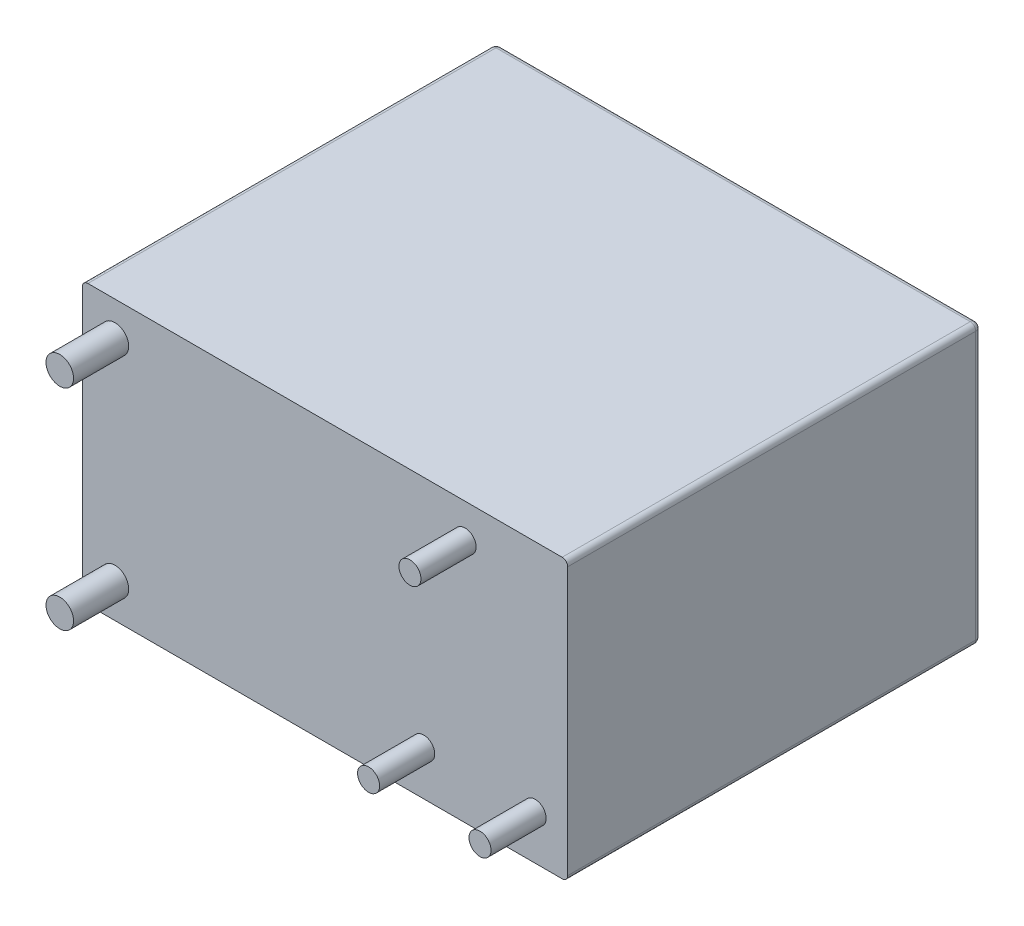
ISO-10303-21;
HEADER;
FILE_DESCRIPTION(('STEP AP214'),'2;1');
FILE_NAME('part.step','',(''),(''),'','','');
FILE_SCHEMA(('AUTOMOTIVE_DESIGN { 1 0 10303 214 1 1 1 1 }'));
ENDSEC;
DATA;
#1=APPLICATION_CONTEXT('core data for automotive mechanical design processes');
#2=APPLICATION_PROTOCOL_DEFINITION('international standard','automotive_design',2000,#1);
#3=PRODUCT_CONTEXT('',#1,'mechanical');
#4=PRODUCT('Part','Part','',(#3));
#5=PRODUCT_RELATED_PRODUCT_CATEGORY('part','',(#4));
#6=PRODUCT_DEFINITION_FORMATION('','',#4);
#7=PRODUCT_DEFINITION_CONTEXT('part definition',#1,'design');
#8=PRODUCT_DEFINITION('design','',#6,#7);
#9=PRODUCT_DEFINITION_SHAPE('','',#8);
#10=(LENGTH_UNIT() NAMED_UNIT(*) SI_UNIT(.MILLI.,.METRE.));
#11=(NAMED_UNIT(*) PLANE_ANGLE_UNIT() SI_UNIT($,.RADIAN.));
#12=(NAMED_UNIT(*) SI_UNIT($,.STERADIAN.) SOLID_ANGLE_UNIT());
#13=UNCERTAINTY_MEASURE_WITH_UNIT(LENGTH_MEASURE(1.E-05),#10,'distance_accuracy_value','');
#14=(GEOMETRIC_REPRESENTATION_CONTEXT(3) GLOBAL_UNCERTAINTY_ASSIGNED_CONTEXT((#13)) GLOBAL_UNIT_ASSIGNED_CONTEXT((#10,
#11,#12)) REPRESENTATION_CONTEXT('',''));
#15=CARTESIAN_POINT('',(0.,0.,0.));
#16=DIRECTION('',(0.,0.,1.));
#17=DIRECTION('',(1.,0.,0.));
#18=AXIS2_PLACEMENT_3D('',#15,#16,#17);
#19=CARTESIAN_POINT('',(0.,0.,-15.));
#20=DIRECTION('',(-1.,0.,0.));
#21=DIRECTION('',(0.,0.,1.));
#22=AXIS2_PLACEMENT_3D('',#19,#20,#21);
#23=PLANE('',#22);
#24=DIRECTION('',(0.,-1.,0.));
#25=VECTOR('',#24,1.);
#26=CARTESIAN_POINT('',(0.,0.,-14.8));
#27=LINE('',#26,#25);
#28=CARTESIAN_POINT('',(0.,9.9,-14.8));
#29=VERTEX_POINT('',#28);
#30=CARTESIAN_POINT('',(0.,0.2,-14.8));
#31=VERTEX_POINT('',#30);
#32=EDGE_CURVE('E156',#29,#31,#27,.T.);
#33=ORIENTED_EDGE('',*,*,#32,.T.);
#34=DIRECTION('',(0.,0.,1.));
#35=VECTOR('',#34,1.);
#36=CARTESIAN_POINT('',(0.,0.2,-15.));
#37=LINE('',#36,#35);
#38=CARTESIAN_POINT('',(0.,0.2,0.));
#39=VERTEX_POINT('',#38);
#40=EDGE_CURVE('E158',#31,#39,#37,.T.);
#41=ORIENTED_EDGE('',*,*,#40,.T.);
#42=DIRECTION('',(0.,-1.,0.));
#43=VECTOR('',#42,1.);
#44=CARTESIAN_POINT('',(0.,0.,0.));
#45=LINE('',#44,#43);
#46=CARTESIAN_POINT('',(0.,9.9,0.));
#47=VERTEX_POINT('',#46);
#48=EDGE_CURVE('E117',#47,#39,#45,.T.);
#49=ORIENTED_EDGE('',*,*,#48,.F.);
#50=DIRECTION('',(0.,0.,1.));
#51=VECTOR('',#50,1.);
#52=CARTESIAN_POINT('',(0.,9.9,-15.));
#53=LINE('',#52,#51);
#54=EDGE_CURVE('E154',#47,#29,#53,.F.);
#55=ORIENTED_EDGE('',*,*,#54,.T.);
#56=EDGE_LOOP('',(#33,#41,#49,#55));
#57=FACE_BOUND('',#56,.T.);
#58=ADVANCED_FACE('F35',(#57),#23,.T.);
#59=CARTESIAN_POINT('',(0.,10.1,-15.));
#60=DIRECTION('',(0.,1.,0.));
#61=DIRECTION('',(0.,0.,1.));
#62=AXIS2_PLACEMENT_3D('',#59,#60,#61);
#63=PLANE('',#62);
#64=DIRECTION('',(-1.,0.,0.));
#65=VECTOR('',#64,1.);
#66=CARTESIAN_POINT('',(0.,10.1,-14.8));
#67=LINE('',#66,#65);
#68=CARTESIAN_POINT('',(17.4,10.1,-14.8));
#69=VERTEX_POINT('',#68);
#70=CARTESIAN_POINT('',(0.2,10.1,-14.8));
#71=VERTEX_POINT('',#70);
#72=EDGE_CURVE('E51',#69,#71,#67,.T.);
#73=ORIENTED_EDGE('',*,*,#72,.T.);
#74=DIRECTION('',(0.,0.,1.));
#75=VECTOR('',#74,1.);
#76=CARTESIAN_POINT('',(0.2,10.1,-15.));
#77=LINE('',#76,#75);
#78=CARTESIAN_POINT('',(0.2,10.1,0.));
#79=VERTEX_POINT('',#78);
#80=EDGE_CURVE('E11',#71,#79,#77,.T.);
#81=ORIENTED_EDGE('',*,*,#80,.T.);
#82=DIRECTION('',(-1.,0.,0.));
#83=VECTOR('',#82,1.);
#84=CARTESIAN_POINT('',(0.,10.1,0.));
#85=LINE('',#84,#83);
#86=CARTESIAN_POINT('',(17.4,10.1,0.));
#87=VERTEX_POINT('',#86);
#88=EDGE_CURVE('E231',#87,#79,#85,.T.);
#89=ORIENTED_EDGE('',*,*,#88,.F.);
#90=DIRECTION('',(0.,0.,1.));
#91=VECTOR('',#90,1.);
#92=CARTESIAN_POINT('',(17.4,10.1,-15.));
#93=LINE('',#92,#91);
#94=EDGE_CURVE('E44',#87,#69,#93,.F.);
#95=ORIENTED_EDGE('',*,*,#94,.T.);
#96=EDGE_LOOP('',(#73,#81,#89,#95));
#97=FACE_BOUND('',#96,.T.);
#98=ADVANCED_FACE('F276',(#97),#63,.T.);
#99=CARTESIAN_POINT('',(17.6,0.,-15.));
#100=DIRECTION('',(1.,0.,0.));
#101=DIRECTION('',(0.,0.,-1.));
#102=AXIS2_PLACEMENT_3D('',#99,#100,#101);
#103=PLANE('',#102);
#104=DIRECTION('',(0.,1.,0.));
#105=VECTOR('',#104,1.);
#106=CARTESIAN_POINT('',(17.6,0.,0.));
#107=LINE('',#106,#105);
#108=CARTESIAN_POINT('',(17.6,0.2,0.));
#109=VERTEX_POINT('',#108);
#110=CARTESIAN_POINT('',(17.6,9.9,0.));
#111=VERTEX_POINT('',#110);
#112=EDGE_CURVE('E131',#109,#111,#107,.T.);
#113=ORIENTED_EDGE('',*,*,#112,.F.);
#114=DIRECTION('',(0.,0.,1.));
#115=VECTOR('',#114,1.);
#116=CARTESIAN_POINT('',(17.6,0.2,-15.));
#117=LINE('',#116,#115);
#118=CARTESIAN_POINT('',(17.6,0.2,-14.8));
#119=VERTEX_POINT('',#118);
#120=EDGE_CURVE('E152',#109,#119,#117,.F.);
#121=ORIENTED_EDGE('',*,*,#120,.T.);
#122=DIRECTION('',(0.,1.,0.));
#123=VECTOR('',#122,1.);
#124=CARTESIAN_POINT('',(17.6,0.,-14.8));
#125=LINE('',#124,#123);
#126=CARTESIAN_POINT('',(17.6,9.9,-14.8));
#127=VERTEX_POINT('',#126);
#128=EDGE_CURVE('E150',#119,#127,#125,.T.);
#129=ORIENTED_EDGE('',*,*,#128,.T.);
#130=DIRECTION('',(0.,0.,1.));
#131=VECTOR('',#130,1.);
#132=CARTESIAN_POINT('',(17.6,9.9,-15.));
#133=LINE('',#132,#131);
#134=EDGE_CURVE('E148',#127,#111,#133,.T.);
#135=ORIENTED_EDGE('',*,*,#134,.T.);
#136=EDGE_LOOP('',(#113,#121,#129,#135));
#137=FACE_BOUND('',#136,.T.);
#138=ADVANCED_FACE('F282',(#137),#103,.T.);
#139=CARTESIAN_POINT('',(0.,0.,-15.));
#140=DIRECTION('',(0.,-1.,0.));
#141=DIRECTION('',(0.,0.,-1.));
#142=AXIS2_PLACEMENT_3D('',#139,#140,#141);
#143=PLANE('',#142);
#144=DIRECTION('',(1.,0.,0.));
#145=VECTOR('',#144,1.);
#146=CARTESIAN_POINT('',(0.,0.,-14.8));
#147=LINE('',#146,#145);
#148=CARTESIAN_POINT('',(0.2,0.,-14.8));
#149=VERTEX_POINT('',#148);
#150=CARTESIAN_POINT('',(17.4,0.,-14.8));
#151=VERTEX_POINT('',#150);
#152=EDGE_CURVE('E137',#149,#151,#147,.T.);
#153=ORIENTED_EDGE('',*,*,#152,.T.);
#154=DIRECTION('',(0.,0.,1.));
#155=VECTOR('',#154,1.);
#156=CARTESIAN_POINT('',(17.4,0.,-15.));
#157=LINE('',#156,#155);
#158=CARTESIAN_POINT('',(17.4,0.,0.));
#159=VERTEX_POINT('',#158);
#160=EDGE_CURVE('E130',#151,#159,#157,.T.);
#161=ORIENTED_EDGE('',*,*,#160,.T.);
#162=DIRECTION('',(1.,0.,0.));
#163=VECTOR('',#162,1.);
#164=CARTESIAN_POINT('',(0.,0.,0.));
#165=LINE('',#164,#163);
#166=CARTESIAN_POINT('',(0.2,0.,0.));
#167=VERTEX_POINT('',#166);
#168=EDGE_CURVE('E115',#167,#159,#165,.T.);
#169=ORIENTED_EDGE('',*,*,#168,.F.);
#170=DIRECTION('',(0.,0.,1.));
#171=VECTOR('',#170,1.);
#172=CARTESIAN_POINT('',(0.2,0.,-15.));
#173=LINE('',#172,#171);
#174=EDGE_CURVE('E127',#167,#149,#173,.F.);
#175=ORIENTED_EDGE('',*,*,#174,.T.);
#176=EDGE_LOOP('',(#153,#161,#169,#175));
#177=FACE_BOUND('',#176,.T.);
#178=ADVANCED_FACE('F126',(#177),#143,.T.);
#179=CARTESIAN_POINT('',(0.,0.,-15.));
#180=DIRECTION('',(0.,0.,-1.));
#181=DIRECTION('',(-1.,0.,0.));
#182=AXIS2_PLACEMENT_3D('',#179,#180,#181);
#183=PLANE('',#182);
#184=CARTESIAN_POINT('',(1.93925831557391,1.32698570753947,-15.));
#185=DIRECTION('',(0.,0.,-1.));
#186=DIRECTION('',(-1.,0.,0.));
#187=AXIS2_PLACEMENT_3D('',#184,#185,#186);
#188=CIRCLE('',#187,0.5);
#189=CARTESIAN_POINT('',(1.43925831557391,1.32698570753947,-15.));
#190=VERTEX_POINT('',#189);
#191=EDGE_CURVE('E217',#190,#190,#188,.T.);
#192=ORIENTED_EDGE('',*,*,#191,.F.);
#193=EDGE_LOOP('',(#192));
#194=FACE_BOUND('',#193,.T.);
#195=DIRECTION('',(0.,1.,0.));
#196=VECTOR('',#195,1.);
#197=CARTESIAN_POINT('',(17.4,0.,-15.));
#198=LINE('',#197,#196);
#199=CARTESIAN_POINT('',(17.4,9.9,-15.));
#200=VERTEX_POINT('',#199);
#201=CARTESIAN_POINT('',(17.4,0.2,-15.));
#202=VERTEX_POINT('',#201);
#203=EDGE_CURVE('E164',#200,#202,#198,.F.);
#204=ORIENTED_EDGE('',*,*,#203,.T.);
#205=DIRECTION('',(1.,0.,0.));
#206=VECTOR('',#205,1.);
#207=CARTESIAN_POINT('',(0.,0.2,-15.));
#208=LINE('',#207,#206);
#209=CARTESIAN_POINT('',(0.2,0.2,-15.));
#210=VERTEX_POINT('',#209);
#211=EDGE_CURVE('E166',#202,#210,#208,.F.);
#212=ORIENTED_EDGE('',*,*,#211,.T.);
#213=DIRECTION('',(0.,-1.,0.));
#214=VECTOR('',#213,1.);
#215=CARTESIAN_POINT('',(0.2,0.,-15.));
#216=LINE('',#215,#214);
#217=CARTESIAN_POINT('',(0.2,9.9,-15.));
#218=VERTEX_POINT('',#217);
#219=EDGE_CURVE('E162',#210,#218,#216,.F.);
#220=ORIENTED_EDGE('',*,*,#219,.T.);
#221=DIRECTION('',(-1.,0.,0.));
#222=VECTOR('',#221,1.);
#223=CARTESIAN_POINT('',(0.,9.9,-15.));
#224=LINE('',#223,#222);
#225=EDGE_CURVE('E160',#218,#200,#224,.F.);
#226=ORIENTED_EDGE('',*,*,#225,.T.);
#227=EDGE_LOOP('',(#204,#212,#220,#226));
#228=FACE_BOUND('',#227,.T.);
#229=ADVANCED_FACE('F253',(#194,#228),#183,.T.);
#230=CARTESIAN_POINT('',(0.,0.,0.));
#231=DIRECTION('',(0.,0.,-1.));
#232=DIRECTION('',(-1.,0.,0.));
#233=AXIS2_PLACEMENT_3D('',#230,#231,#232);
#234=PLANE('',#233);
#235=CARTESIAN_POINT('',(1.18,1.24,0.));
#236=DIRECTION('',(0.,0.,-1.));
#237=DIRECTION('',(-1.,0.,0.));
#238=AXIS2_PLACEMENT_3D('',#235,#236,#237);
#239=CIRCLE('',#238,0.5);
#240=CARTESIAN_POINT('',(0.68,1.24,0.));
#241=VERTEX_POINT('',#240);
#242=EDGE_CURVE('E141',#241,#241,#239,.F.);
#243=ORIENTED_EDGE('',*,*,#242,.F.);
#244=EDGE_LOOP('',(#243));
#245=FACE_BOUND('',#244,.T.);
#246=CARTESIAN_POINT('',(16.42,1.6069825328216,0.));
#247=DIRECTION('',(0.,0.,-1.));
#248=DIRECTION('',(-1.,0.,0.));
#249=AXIS2_PLACEMENT_3D('',#246,#247,#248);
#250=CIRCLE('',#249,0.400000000000001);
#251=CARTESIAN_POINT('',(16.02,1.6069825328216,0.));
#252=VERTEX_POINT('',#251);
#253=EDGE_CURVE('E243',#252,#252,#250,.F.);
#254=ORIENTED_EDGE('',*,*,#253,.F.);
#255=EDGE_LOOP('',(#254));
#256=FACE_BOUND('',#255,.T.);
#257=CARTESIAN_POINT('',(12.38,1.60698253282159,0.));
#258=DIRECTION('',(0.,0.,-1.));
#259=DIRECTION('',(-1.,0.,0.));
#260=AXIS2_PLACEMENT_3D('',#257,#258,#259);
#261=CIRCLE('',#260,0.399999999999999);
#262=CARTESIAN_POINT('',(11.98,1.60698253282159,0.));
#263=VERTEX_POINT('',#262);
#264=EDGE_CURVE('E240',#263,#263,#261,.F.);
#265=ORIENTED_EDGE('',*,*,#264,.F.);
#266=EDGE_LOOP('',(#265));
#267=FACE_BOUND('',#266,.T.);
#268=CARTESIAN_POINT('',(13.88,8.86,0.));
#269=DIRECTION('',(0.,0.,-1.));
#270=DIRECTION('',(-1.,0.,0.));
#271=AXIS2_PLACEMENT_3D('',#268,#269,#270);
#272=CIRCLE('',#271,0.399999999999999);
#273=CARTESIAN_POINT('',(13.48,8.86,0.));
#274=VERTEX_POINT('',#273);
#275=EDGE_CURVE('E237',#274,#274,#272,.F.);
#276=ORIENTED_EDGE('',*,*,#275,.F.);
#277=EDGE_LOOP('',(#276));
#278=FACE_BOUND('',#277,.T.);
#279=CARTESIAN_POINT('',(1.18,8.86,0.));
#280=DIRECTION('',(0.,0.,-1.));
#281=DIRECTION('',(-1.,0.,0.));
#282=AXIS2_PLACEMENT_3D('',#279,#280,#281);
#283=CIRCLE('',#282,0.500000000000001);
#284=CARTESIAN_POINT('',(0.679999999999999,8.86,0.));
#285=VERTEX_POINT('',#284);
#286=EDGE_CURVE('E234',#285,#285,#283,.F.);
#287=ORIENTED_EDGE('',*,*,#286,.F.);
#288=EDGE_LOOP('',(#287));
#289=FACE_BOUND('',#288,.T.);
#290=ORIENTED_EDGE('',*,*,#168,.T.);
#291=CARTESIAN_POINT('',(17.4,0.2,0.));
#292=DIRECTION('',(0.,0.,-1.));
#293=DIRECTION('',(-1.,0.,0.));
#294=AXIS2_PLACEMENT_3D('',#291,#292,#293);
#295=CIRCLE('',#294,0.2);
#296=EDGE_CURVE('E121',#159,#109,#295,.F.);
#297=ORIENTED_EDGE('',*,*,#296,.T.);
#298=ORIENTED_EDGE('',*,*,#112,.T.);
#299=CARTESIAN_POINT('',(17.4,9.9,0.));
#300=DIRECTION('',(0.,0.,-1.));
#301=DIRECTION('',(-1.,0.,0.));
#302=AXIS2_PLACEMENT_3D('',#299,#300,#301);
#303=CIRCLE('',#302,0.2);
#304=EDGE_CURVE('E139',#111,#87,#303,.F.);
#305=ORIENTED_EDGE('',*,*,#304,.T.);
#306=ORIENTED_EDGE('',*,*,#88,.T.);
#307=CARTESIAN_POINT('',(0.2,9.9,0.));
#308=DIRECTION('',(0.,0.,-1.));
#309=DIRECTION('',(-1.,0.,0.));
#310=AXIS2_PLACEMENT_3D('',#307,#308,#309);
#311=CIRCLE('',#310,0.2);
#312=EDGE_CURVE('E122',#79,#47,#311,.F.);
#313=ORIENTED_EDGE('',*,*,#312,.T.);
#314=ORIENTED_EDGE('',*,*,#48,.T.);
#315=CARTESIAN_POINT('',(0.2,0.2,0.));
#316=DIRECTION('',(0.,0.,-1.));
#317=DIRECTION('',(-1.,0.,0.));
#318=AXIS2_PLACEMENT_3D('',#315,#316,#317);
#319=CIRCLE('',#318,0.2);
#320=EDGE_CURVE('E112',#39,#167,#319,.F.);
#321=ORIENTED_EDGE('',*,*,#320,.T.);
#322=EDGE_LOOP('',(#290,#297,#298,#305,#306,#313,#314,#321));
#323=FACE_BOUND('',#322,.T.);
#324=ADVANCED_FACE('F114',(#245,#256,#267,#278,#289,#323),#234,.F.);
#325=CARTESIAN_POINT('',(1.18,8.86,2.));
#326=DIRECTION('',(0.,0.,-1.));
#327=DIRECTION('',(-1.,0.,0.));
#328=AXIS2_PLACEMENT_3D('',#325,#326,#327);
#329=CYLINDRICAL_SURFACE('',#328,0.500000000000001);
#330=CARTESIAN_POINT('',(1.18,8.86,2.));
#331=DIRECTION('',(0.,0.,1.));
#332=DIRECTION('',(1.,0.,0.));
#333=AXIS2_PLACEMENT_3D('',#330,#331,#332);
#334=CIRCLE('',#333,0.500000000000001);
#335=CARTESIAN_POINT('',(1.68,8.86,2.));
#336=VERTEX_POINT('',#335);
#337=EDGE_CURVE('E225',#336,#336,#334,.T.);
#338=ORIENTED_EDGE('',*,*,#337,.F.);
#339=EDGE_LOOP('',(#338));
#340=FACE_BOUND('',#339,.T.);
#341=ORIENTED_EDGE('',*,*,#286,.T.);
#342=EDGE_LOOP('',(#341));
#343=FACE_BOUND('',#342,.T.);
#344=ADVANCED_FACE('F252',(#340,#343),#329,.T.);
#345=CARTESIAN_POINT('',(1.18,8.86,2.));
#346=DIRECTION('',(0.,0.,1.));
#347=DIRECTION('',(1.,0.,0.));
#348=AXIS2_PLACEMENT_3D('',#345,#346,#347);
#349=PLANE('',#348);
#350=ORIENTED_EDGE('',*,*,#337,.T.);
#351=EDGE_LOOP('',(#350));
#352=FACE_BOUND('',#351,.T.);
#353=ADVANCED_FACE('F264',(#352),#349,.T.);
#354=CARTESIAN_POINT('',(13.88,8.86,2.));
#355=DIRECTION('',(0.,0.,-1.));
#356=DIRECTION('',(-1.,0.,0.));
#357=AXIS2_PLACEMENT_3D('',#354,#355,#356);
#358=CYLINDRICAL_SURFACE('',#357,0.399999999999999);
#359=CARTESIAN_POINT('',(13.88,8.86,2.));
#360=DIRECTION('',(0.,0.,1.));
#361=DIRECTION('',(1.,0.,0.));
#362=AXIS2_PLACEMENT_3D('',#359,#360,#361);
#363=CIRCLE('',#362,0.399999999999999);
#364=CARTESIAN_POINT('',(14.28,8.86,2.));
#365=VERTEX_POINT('',#364);
#366=EDGE_CURVE('E222',#365,#365,#363,.T.);
#367=ORIENTED_EDGE('',*,*,#366,.F.);
#368=EDGE_LOOP('',(#367));
#369=FACE_BOUND('',#368,.T.);
#370=ORIENTED_EDGE('',*,*,#275,.T.);
#371=EDGE_LOOP('',(#370));
#372=FACE_BOUND('',#371,.T.);
#373=ADVANCED_FACE('F270',(#369,#372),#358,.T.);
#374=CARTESIAN_POINT('',(13.88,8.86,2.));
#375=DIRECTION('',(0.,0.,1.));
#376=DIRECTION('',(1.,0.,0.));
#377=AXIS2_PLACEMENT_3D('',#374,#375,#376);
#378=PLANE('',#377);
#379=ORIENTED_EDGE('',*,*,#366,.T.);
#380=EDGE_LOOP('',(#379));
#381=FACE_BOUND('',#380,.T.);
#382=ADVANCED_FACE('F395',(#381),#378,.T.);
#383=CARTESIAN_POINT('',(12.38,1.60698253282159,2.));
#384=DIRECTION('',(0.,0.,-1.));
#385=DIRECTION('',(-1.,0.,0.));
#386=AXIS2_PLACEMENT_3D('',#383,#384,#385);
#387=CYLINDRICAL_SURFACE('',#386,0.399999999999999);
#388=CARTESIAN_POINT('',(12.38,1.60698253282159,2.));
#389=DIRECTION('',(0.,0.,1.));
#390=DIRECTION('',(1.,0.,0.));
#391=AXIS2_PLACEMENT_3D('',#388,#389,#390);
#392=CIRCLE('',#391,0.399999999999999);
#393=CARTESIAN_POINT('',(12.78,1.60698253282159,2.));
#394=VERTEX_POINT('',#393);
#395=EDGE_CURVE('E214',#394,#394,#392,.T.);
#396=ORIENTED_EDGE('',*,*,#395,.F.);
#397=EDGE_LOOP('',(#396));
#398=FACE_BOUND('',#397,.T.);
#399=ORIENTED_EDGE('',*,*,#264,.T.);
#400=EDGE_LOOP('',(#399));
#401=FACE_BOUND('',#400,.T.);
#402=ADVANCED_FACE('F391',(#398,#401),#387,.T.);
#403=CARTESIAN_POINT('',(12.38,1.60698253282159,2.));
#404=DIRECTION('',(0.,0.,1.));
#405=DIRECTION('',(1.,0.,0.));
#406=AXIS2_PLACEMENT_3D('',#403,#404,#405);
#407=PLANE('',#406);
#408=ORIENTED_EDGE('',*,*,#395,.T.);
#409=EDGE_LOOP('',(#408));
#410=FACE_BOUND('',#409,.T.);
#411=ADVANCED_FACE('F387',(#410),#407,.T.);
#412=CARTESIAN_POINT('',(16.42,1.6069825328216,2.));
#413=DIRECTION('',(0.,0.,-1.));
#414=DIRECTION('',(-1.,0.,0.));
#415=AXIS2_PLACEMENT_3D('',#412,#413,#414);
#416=CYLINDRICAL_SURFACE('',#415,0.400000000000001);
#417=CARTESIAN_POINT('',(16.42,1.6069825328216,2.));
#418=DIRECTION('',(0.,0.,1.));
#419=DIRECTION('',(1.,0.,0.));
#420=AXIS2_PLACEMENT_3D('',#417,#418,#419);
#421=CIRCLE('',#420,0.400000000000001);
#422=CARTESIAN_POINT('',(16.82,1.6069825328216,2.));
#423=VERTEX_POINT('',#422);
#424=EDGE_CURVE('E209',#423,#423,#421,.T.);
#425=ORIENTED_EDGE('',*,*,#424,.F.);
#426=EDGE_LOOP('',(#425));
#427=FACE_BOUND('',#426,.T.);
#428=ORIENTED_EDGE('',*,*,#253,.T.);
#429=EDGE_LOOP('',(#428));
#430=FACE_BOUND('',#429,.T.);
#431=ADVANCED_FACE('F383',(#427,#430),#416,.T.);
#432=CARTESIAN_POINT('',(16.42,1.6069825328216,2.));
#433=DIRECTION('',(0.,0.,1.));
#434=DIRECTION('',(1.,0.,0.));
#435=AXIS2_PLACEMENT_3D('',#432,#433,#434);
#436=PLANE('',#435);
#437=ORIENTED_EDGE('',*,*,#424,.T.);
#438=EDGE_LOOP('',(#437));
#439=FACE_BOUND('',#438,.T.);
#440=ADVANCED_FACE('F379',(#439),#436,.T.);
#441=CARTESIAN_POINT('',(1.18,1.24,2.));
#442=DIRECTION('',(0.,0.,-1.));
#443=DIRECTION('',(-1.,0.,0.));
#444=AXIS2_PLACEMENT_3D('',#441,#442,#443);
#445=CYLINDRICAL_SURFACE('',#444,0.5);
#446=CARTESIAN_POINT('',(1.18,1.24,2.));
#447=DIRECTION('',(0.,0.,1.));
#448=DIRECTION('',(-1.,0.,0.));
#449=AXIS2_PLACEMENT_3D('',#446,#447,#448);
#450=CIRCLE('',#449,0.5);
#451=CARTESIAN_POINT('',(0.68,1.24,2.));
#452=VERTEX_POINT('',#451);
#453=EDGE_CURVE('E204',#452,#452,#450,.T.);
#454=ORIENTED_EDGE('',*,*,#453,.F.);
#455=EDGE_LOOP('',(#454));
#456=FACE_BOUND('',#455,.T.);
#457=ORIENTED_EDGE('',*,*,#242,.T.);
#458=EDGE_LOOP('',(#457));
#459=FACE_BOUND('',#458,.T.);
#460=ADVANCED_FACE('F248',(#456,#459),#445,.T.);
#461=CARTESIAN_POINT('',(1.18,1.24,2.));
#462=DIRECTION('',(0.,0.,-1.));
#463=DIRECTION('',(-1.,0.,0.));
#464=AXIS2_PLACEMENT_3D('',#461,#462,#463);
#465=PLANE('',#464);
#466=ORIENTED_EDGE('',*,*,#453,.T.);
#467=EDGE_LOOP('',(#466));
#468=FACE_BOUND('',#467,.T.);
#469=ADVANCED_FACE('F329',(#468),#465,.F.);
#470=CARTESIAN_POINT('',(0.2,9.9,-15.));
#471=DIRECTION('',(0.,0.,1.));
#472=DIRECTION('',(1.,0.,0.));
#473=AXIS2_PLACEMENT_3D('',#470,#471,#472);
#474=CYLINDRICAL_SURFACE('',#473,0.2);
#475=CARTESIAN_POINT('',(0.2,9.9,-14.8));
#476=DIRECTION('',(0.,0.,-1.));
#477=DIRECTION('',(-1.,0.,0.));
#478=AXIS2_PLACEMENT_3D('',#475,#476,#477);
#479=CIRCLE('',#478,0.2);
#480=EDGE_CURVE('E39',#29,#71,#479,.T.);
#481=ORIENTED_EDGE('',*,*,#480,.F.);
#482=ORIENTED_EDGE('',*,*,#54,.F.);
#483=ORIENTED_EDGE('',*,*,#312,.F.);
#484=ORIENTED_EDGE('',*,*,#80,.F.);
#485=EDGE_LOOP('',(#481,#482,#483,#484));
#486=FACE_BOUND('',#485,.T.);
#487=ADVANCED_FACE('F37',(#486),#474,.T.);
#488=CARTESIAN_POINT('',(0.2,9.9,-14.8));
#489=DIRECTION('',(0.,0.,1.));
#490=DIRECTION('',(1.,0.,0.));
#491=AXIS2_PLACEMENT_3D('',#488,#489,#490);
#492=SPHERICAL_SURFACE('',#491,0.2);
#493=CARTESIAN_POINT('',(0.2,9.9,-14.8));
#494=DIRECTION('',(0.,1.,0.));
#495=DIRECTION('',(0.,0.,1.));
#496=AXIS2_PLACEMENT_3D('',#493,#494,#495);
#497=CIRCLE('',#496,0.2);
#498=EDGE_CURVE('E196',#29,#218,#497,.F.);
#499=ORIENTED_EDGE('',*,*,#498,.F.);
#500=ORIENTED_EDGE('',*,*,#480,.T.);
#501=CARTESIAN_POINT('',(0.2,9.9,-14.8));
#502=DIRECTION('',(-1.,0.,0.));
#503=DIRECTION('',(0.,0.,1.));
#504=AXIS2_PLACEMENT_3D('',#501,#502,#503);
#505=CIRCLE('',#504,0.2);
#506=EDGE_CURVE('E198',#218,#71,#505,.F.);
#507=ORIENTED_EDGE('',*,*,#506,.F.);
#508=EDGE_LOOP('',(#499,#500,#507));
#509=FACE_BOUND('',#508,.T.);
#510=ADVANCED_FACE('F323',(#509),#492,.T.);
#511=CARTESIAN_POINT('',(17.4,9.9,-15.));
#512=DIRECTION('',(0.,0.,1.));
#513=DIRECTION('',(1.,0.,0.));
#514=AXIS2_PLACEMENT_3D('',#511,#512,#513);
#515=CYLINDRICAL_SURFACE('',#514,0.2);
#516=ORIENTED_EDGE('',*,*,#304,.F.);
#517=ORIENTED_EDGE('',*,*,#134,.F.);
#518=CARTESIAN_POINT('',(17.4,9.9,-14.8));
#519=DIRECTION('',(0.,0.,-1.));
#520=DIRECTION('',(-1.,0.,0.));
#521=AXIS2_PLACEMENT_3D('',#518,#519,#520);
#522=CIRCLE('',#521,0.2);
#523=EDGE_CURVE('E193',#69,#127,#522,.T.);
#524=ORIENTED_EDGE('',*,*,#523,.F.);
#525=ORIENTED_EDGE('',*,*,#94,.F.);
#526=EDGE_LOOP('',(#516,#517,#524,#525));
#527=FACE_BOUND('',#526,.T.);
#528=ADVANCED_FACE('F321',(#527),#515,.T.);
#529=CARTESIAN_POINT('',(0.,9.9,-14.8));
#530=DIRECTION('',(-1.,0.,0.));
#531=DIRECTION('',(0.,0.,1.));
#532=AXIS2_PLACEMENT_3D('',#529,#530,#531);
#533=CYLINDRICAL_SURFACE('',#532,0.2);
#534=ORIENTED_EDGE('',*,*,#506,.T.);
#535=ORIENTED_EDGE('',*,*,#72,.F.);
#536=CARTESIAN_POINT('',(17.4,9.9,-14.8));
#537=DIRECTION('',(1.,0.,0.));
#538=DIRECTION('',(0.,0.,-1.));
#539=AXIS2_PLACEMENT_3D('',#536,#537,#538);
#540=CIRCLE('',#539,0.2);
#541=EDGE_CURVE('E190',#200,#69,#540,.T.);
#542=ORIENTED_EDGE('',*,*,#541,.F.);
#543=ORIENTED_EDGE('',*,*,#225,.F.);
#544=EDGE_LOOP('',(#534,#535,#542,#543));
#545=FACE_BOUND('',#544,.T.);
#546=ADVANCED_FACE('F317',(#545),#533,.T.);
#547=CARTESIAN_POINT('',(0.2,0.,-14.8));
#548=DIRECTION('',(0.,-1.,0.));
#549=DIRECTION('',(0.,0.,-1.));
#550=AXIS2_PLACEMENT_3D('',#547,#548,#549);
#551=CYLINDRICAL_SURFACE('',#550,0.2);
#552=ORIENTED_EDGE('',*,*,#498,.T.);
#553=ORIENTED_EDGE('',*,*,#219,.F.);
#554=CARTESIAN_POINT('',(0.2,0.2,-14.8));
#555=DIRECTION('',(0.,-1.,0.));
#556=DIRECTION('',(0.,0.,-1.));
#557=AXIS2_PLACEMENT_3D('',#554,#555,#556);
#558=CIRCLE('',#557,0.2);
#559=EDGE_CURVE('E187',#31,#210,#558,.T.);
#560=ORIENTED_EDGE('',*,*,#559,.F.);
#561=ORIENTED_EDGE('',*,*,#32,.F.);
#562=EDGE_LOOP('',(#552,#553,#560,#561));
#563=FACE_BOUND('',#562,.T.);
#564=ADVANCED_FACE('F314',(#563),#551,.T.);
#565=CARTESIAN_POINT('',(0.2,0.2,-15.));
#566=DIRECTION('',(0.,0.,1.));
#567=DIRECTION('',(1.,0.,0.));
#568=AXIS2_PLACEMENT_3D('',#565,#566,#567);
#569=CYLINDRICAL_SURFACE('',#568,0.2);
#570=ORIENTED_EDGE('',*,*,#320,.F.);
#571=ORIENTED_EDGE('',*,*,#40,.F.);
#572=CARTESIAN_POINT('',(0.2,0.2,-14.8));
#573=DIRECTION('',(0.,0.,-1.));
#574=DIRECTION('',(-1.,0.,0.));
#575=AXIS2_PLACEMENT_3D('',#572,#573,#574);
#576=CIRCLE('',#575,0.2);
#577=EDGE_CURVE('E135',#149,#31,#576,.T.);
#578=ORIENTED_EDGE('',*,*,#577,.F.);
#579=ORIENTED_EDGE('',*,*,#174,.F.);
#580=EDGE_LOOP('',(#570,#571,#578,#579));
#581=FACE_BOUND('',#580,.T.);
#582=ADVANCED_FACE('F133',(#581),#569,.T.);
#583=CARTESIAN_POINT('',(17.4,9.9,-14.8));
#584=DIRECTION('',(0.,0.,1.));
#585=DIRECTION('',(1.,0.,0.));
#586=AXIS2_PLACEMENT_3D('',#583,#584,#585);
#587=SPHERICAL_SURFACE('',#586,0.2);
#588=ORIENTED_EDGE('',*,*,#541,.T.);
#589=ORIENTED_EDGE('',*,*,#523,.T.);
#590=CARTESIAN_POINT('',(17.4,9.9,-14.8));
#591=DIRECTION('',(0.,1.,0.));
#592=DIRECTION('',(0.,0.,1.));
#593=AXIS2_PLACEMENT_3D('',#590,#591,#592);
#594=CIRCLE('',#593,0.2);
#595=EDGE_CURVE('E183',#200,#127,#594,.F.);
#596=ORIENTED_EDGE('',*,*,#595,.F.);
#597=EDGE_LOOP('',(#588,#589,#596));
#598=FACE_BOUND('',#597,.T.);
#599=ADVANCED_FACE('F307',(#598),#587,.T.);
#600=CARTESIAN_POINT('',(0.2,0.2,-14.8));
#601=DIRECTION('',(0.,0.,1.));
#602=DIRECTION('',(1.,0.,0.));
#603=AXIS2_PLACEMENT_3D('',#600,#601,#602);
#604=SPHERICAL_SURFACE('',#603,0.2);
#605=ORIENTED_EDGE('',*,*,#577,.T.);
#606=ORIENTED_EDGE('',*,*,#559,.T.);
#607=CARTESIAN_POINT('',(0.2,0.2,-14.8));
#608=DIRECTION('',(-1.,0.,0.));
#609=DIRECTION('',(0.,0.,1.));
#610=AXIS2_PLACEMENT_3D('',#607,#608,#609);
#611=CIRCLE('',#610,0.2);
#612=EDGE_CURVE('E181',#149,#210,#611,.F.);
#613=ORIENTED_EDGE('',*,*,#612,.F.);
#614=EDGE_LOOP('',(#605,#606,#613));
#615=FACE_BOUND('',#614,.T.);
#616=ADVANCED_FACE('F303',(#615),#604,.T.);
#617=CARTESIAN_POINT('',(17.4,0.,-14.8));
#618=DIRECTION('',(0.,1.,0.));
#619=DIRECTION('',(0.,0.,1.));
#620=AXIS2_PLACEMENT_3D('',#617,#618,#619);
#621=CYLINDRICAL_SURFACE('',#620,0.2);
#622=ORIENTED_EDGE('',*,*,#595,.T.);
#623=ORIENTED_EDGE('',*,*,#128,.F.);
#624=CARTESIAN_POINT('',(17.4,0.2,-14.8));
#625=DIRECTION('',(0.,-1.,0.));
#626=DIRECTION('',(0.,0.,-1.));
#627=AXIS2_PLACEMENT_3D('',#624,#625,#626);
#628=CIRCLE('',#627,0.2);
#629=EDGE_CURVE('E178',#202,#119,#628,.T.);
#630=ORIENTED_EDGE('',*,*,#629,.F.);
#631=ORIENTED_EDGE('',*,*,#203,.F.);
#632=EDGE_LOOP('',(#622,#623,#630,#631));
#633=FACE_BOUND('',#632,.T.);
#634=ADVANCED_FACE('F299',(#633),#621,.T.);
#635=CARTESIAN_POINT('',(0.,0.2,-14.8));
#636=DIRECTION('',(1.,0.,0.));
#637=DIRECTION('',(0.,0.,-1.));
#638=AXIS2_PLACEMENT_3D('',#635,#636,#637);
#639=CYLINDRICAL_SURFACE('',#638,0.2);
#640=ORIENTED_EDGE('',*,*,#612,.T.);
#641=ORIENTED_EDGE('',*,*,#211,.F.);
#642=CARTESIAN_POINT('',(17.4,0.2,-14.8));
#643=DIRECTION('',(1.,0.,0.));
#644=DIRECTION('',(0.,0.,-1.));
#645=AXIS2_PLACEMENT_3D('',#642,#643,#644);
#646=CIRCLE('',#645,0.2);
#647=EDGE_CURVE('E174',#151,#202,#646,.T.);
#648=ORIENTED_EDGE('',*,*,#647,.F.);
#649=ORIENTED_EDGE('',*,*,#152,.F.);
#650=EDGE_LOOP('',(#640,#641,#648,#649));
#651=FACE_BOUND('',#650,.T.);
#652=ADVANCED_FACE('F295',(#651),#639,.T.);
#653=CARTESIAN_POINT('',(17.4,0.2,-14.8));
#654=DIRECTION('',(0.,0.,1.));
#655=DIRECTION('',(1.,0.,0.));
#656=AXIS2_PLACEMENT_3D('',#653,#654,#655);
#657=SPHERICAL_SURFACE('',#656,0.2);
#658=ORIENTED_EDGE('',*,*,#647,.T.);
#659=ORIENTED_EDGE('',*,*,#629,.T.);
#660=CARTESIAN_POINT('',(17.4,0.2,-14.8));
#661=DIRECTION('',(0.,0.,-1.));
#662=DIRECTION('',(-1.,0.,0.));
#663=AXIS2_PLACEMENT_3D('',#660,#661,#662);
#664=CIRCLE('',#663,0.2);
#665=EDGE_CURVE('E171',#151,#119,#664,.F.);
#666=ORIENTED_EDGE('',*,*,#665,.F.);
#667=EDGE_LOOP('',(#658,#659,#666));
#668=FACE_BOUND('',#667,.T.);
#669=ADVANCED_FACE('F291',(#668),#657,.T.);
#670=CARTESIAN_POINT('',(17.4,0.2,-15.));
#671=DIRECTION('',(0.,0.,1.));
#672=DIRECTION('',(1.,0.,0.));
#673=AXIS2_PLACEMENT_3D('',#670,#671,#672);
#674=CYLINDRICAL_SURFACE('',#673,0.2);
#675=ORIENTED_EDGE('',*,*,#665,.T.);
#676=ORIENTED_EDGE('',*,*,#120,.F.);
#677=ORIENTED_EDGE('',*,*,#296,.F.);
#678=ORIENTED_EDGE('',*,*,#160,.F.);
#679=EDGE_LOOP('',(#675,#676,#677,#678));
#680=FACE_BOUND('',#679,.T.);
#681=ADVANCED_FACE('F287',(#680),#674,.T.);
#682=CARTESIAN_POINT('',(1.93925831557391,1.32698570753947,-14.5));
#683=DIRECTION('',(0.,0.,-1.));
#684=DIRECTION('',(-1.,0.,0.));
#685=AXIS2_PLACEMENT_3D('',#682,#683,#684);
#686=CYLINDRICAL_SURFACE('',#685,0.5);
#687=CARTESIAN_POINT('',(1.93925831557391,1.32698570753947,-14.5));
#688=DIRECTION('',(0.,0.,-1.));
#689=DIRECTION('',(-1.,0.,0.));
#690=AXIS2_PLACEMENT_3D('',#687,#688,#689);
#691=CIRCLE('',#690,0.5);
#692=CARTESIAN_POINT('',(1.43925831557391,1.32698570753947,-14.5));
#693=VERTEX_POINT('',#692);
#694=EDGE_CURVE('E175',#693,#693,#691,.T.);
#695=ORIENTED_EDGE('',*,*,#694,.F.);
#696=EDGE_LOOP('',(#695));
#697=FACE_BOUND('',#696,.T.);
#698=ORIENTED_EDGE('',*,*,#191,.T.);
#699=EDGE_LOOP('',(#698));
#700=FACE_BOUND('',#699,.T.);
#701=ADVANCED_FACE('F290',(#697,#700),#686,.F.);
#702=CARTESIAN_POINT('',(1.93925831557391,1.32698570753947,-14.5));
#703=DIRECTION('',(0.,0.,-1.));
#704=DIRECTION('',(-1.,0.,0.));
#705=AXIS2_PLACEMENT_3D('',#702,#703,#704);
#706=PLANE('',#705);
#707=ORIENTED_EDGE('',*,*,#694,.T.);
#708=EDGE_LOOP('',(#707));
#709=FACE_BOUND('',#708,.T.);
#710=ADVANCED_FACE('F366',(#709),#706,.T.);
#711=CLOSED_SHELL('',(#58,#98,#138,#178,#229,#324,#344,#353,#373,#382,#402,#411,#431,#440,#460,
#469,#487,#510,#528,#546,#564,#582,#599,#616,#634,#652,#669,#681,#701,#710));
#712=MANIFOLD_SOLID_BREP('B2',#711);
#713=ADVANCED_BREP_SHAPE_REPRESENTATION('',(#18,#712),#14);
#714=SHAPE_DEFINITION_REPRESENTATION(#9,#713);
ENDSEC;
END-ISO-10303-21;
